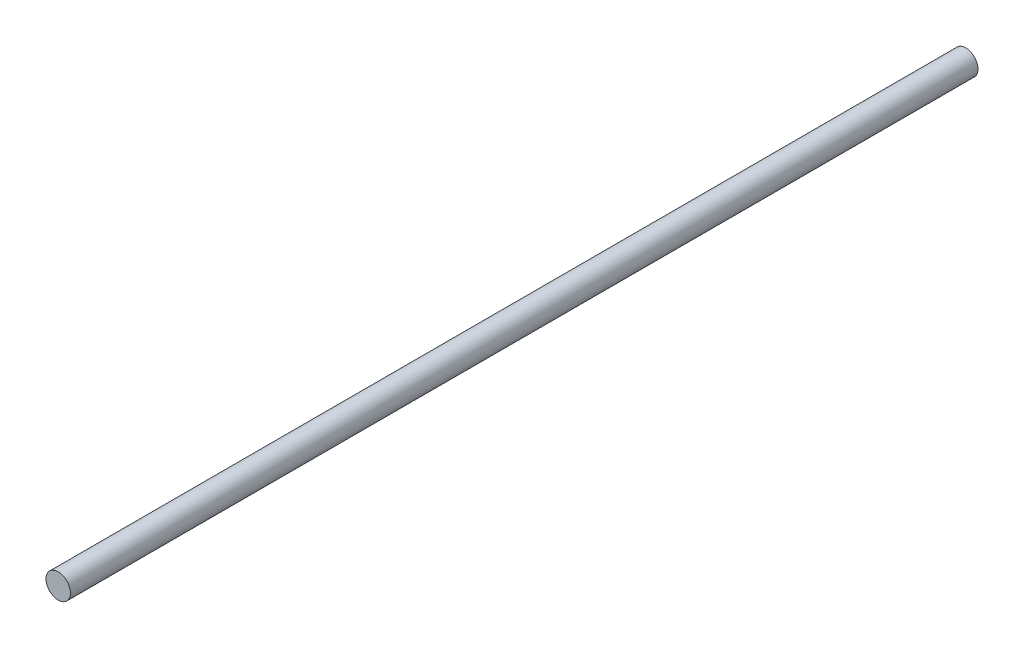
ISO-10303-21;
HEADER;
FILE_DESCRIPTION(('STEP AP214'),'2;1');
FILE_NAME('part.step','',(''),(''),'','','');
FILE_SCHEMA(('AUTOMOTIVE_DESIGN { 1 0 10303 214 1 1 1 1 }'));
ENDSEC;
DATA;
#1=APPLICATION_CONTEXT('core data for automotive mechanical design processes');
#2=APPLICATION_PROTOCOL_DEFINITION('international standard','automotive_design',2000,#1);
#3=PRODUCT_CONTEXT('',#1,'mechanical');
#4=PRODUCT('Part','Part','',(#3));
#5=PRODUCT_RELATED_PRODUCT_CATEGORY('part','',(#4));
#6=PRODUCT_DEFINITION_FORMATION('','',#4);
#7=PRODUCT_DEFINITION_CONTEXT('part definition',#1,'design');
#8=PRODUCT_DEFINITION('design','',#6,#7);
#9=PRODUCT_DEFINITION_SHAPE('','',#8);
#10=(LENGTH_UNIT() NAMED_UNIT(*) SI_UNIT(.MILLI.,.METRE.));
#11=(NAMED_UNIT(*) PLANE_ANGLE_UNIT() SI_UNIT($,.RADIAN.));
#12=(NAMED_UNIT(*) SI_UNIT($,.STERADIAN.) SOLID_ANGLE_UNIT());
#13=UNCERTAINTY_MEASURE_WITH_UNIT(LENGTH_MEASURE(1.E-05),#10,'distance_accuracy_value','');
#14=(GEOMETRIC_REPRESENTATION_CONTEXT(3) GLOBAL_UNCERTAINTY_ASSIGNED_CONTEXT((#13)) GLOBAL_UNIT_ASSIGNED_CONTEXT((#10,
#11,#12)) REPRESENTATION_CONTEXT('',''));
#15=CARTESIAN_POINT('',(0.,0.,0.));
#16=DIRECTION('',(0.,0.,1.));
#17=DIRECTION('',(1.,0.,0.));
#18=AXIS2_PLACEMENT_3D('',#15,#16,#17);
#19=CARTESIAN_POINT('',(0.,0.,4.5));
#20=DIRECTION('',(0.,0.,-1.));
#21=DIRECTION('',(-1.,0.,0.));
#22=AXIS2_PLACEMENT_3D('',#19,#20,#21);
#23=CYLINDRICAL_SURFACE('',#22,3.);
#24=CARTESIAN_POINT('',(0.,0.,0.));
#25=DIRECTION('',(0.,0.,1.));
#26=DIRECTION('',(1.,0.,0.));
#27=AXIS2_PLACEMENT_3D('',#24,#25,#26);
#28=CIRCLE('',#27,3.);
#29=CARTESIAN_POINT('',(3.,0.,0.));
#30=VERTEX_POINT('',#29);
#31=EDGE_CURVE('E10',#30,#30,#28,.T.);
#32=ORIENTED_EDGE('',*,*,#31,.T.);
#33=EDGE_LOOP('',(#32));
#34=FACE_BOUND('',#33,.T.);
#35=CARTESIAN_POINT('',(0.,0.,222.5));
#36=DIRECTION('',(0.,0.,1.));
#37=DIRECTION('',(1.,0.,0.));
#38=AXIS2_PLACEMENT_3D('',#35,#36,#37);
#39=CIRCLE('',#38,3.);
#40=CARTESIAN_POINT('',(3.,0.,222.5));
#41=VERTEX_POINT('',#40);
#42=EDGE_CURVE('E36',#41,#41,#39,.T.);
#43=ORIENTED_EDGE('',*,*,#42,.F.);
#44=EDGE_LOOP('',(#43));
#45=FACE_BOUND('',#44,.T.);
#46=ADVANCED_FACE('F30',(#34,#45),#23,.T.);
#47=CARTESIAN_POINT('',(0.,0.,0.));
#48=DIRECTION('',(0.,0.,1.));
#49=DIRECTION('',(1.,0.,0.));
#50=AXIS2_PLACEMENT_3D('',#47,#48,#49);
#51=PLANE('',#50);
#52=ORIENTED_EDGE('',*,*,#31,.F.);
#53=EDGE_LOOP('',(#52));
#54=FACE_BOUND('',#53,.T.);
#55=ADVANCED_FACE('F45',(#54),#51,.F.);
#56=CARTESIAN_POINT('',(0.,0.,222.5));
#57=DIRECTION('',(0.,0.,1.));
#58=DIRECTION('',(1.,0.,0.));
#59=AXIS2_PLACEMENT_3D('',#56,#57,#58);
#60=PLANE('',#59);
#61=ORIENTED_EDGE('',*,*,#42,.T.);
#62=EDGE_LOOP('',(#61));
#63=FACE_BOUND('',#62,.T.);
#64=ADVANCED_FACE('F42',(#63),#60,.T.);
#65=CLOSED_SHELL('',(#46,#55,#64));
#66=MANIFOLD_SOLID_BREP('B2',#65);
#67=ADVANCED_BREP_SHAPE_REPRESENTATION('',(#18,#66),#14);
#68=SHAPE_DEFINITION_REPRESENTATION(#9,#67);
ENDSEC;
END-ISO-10303-21;
